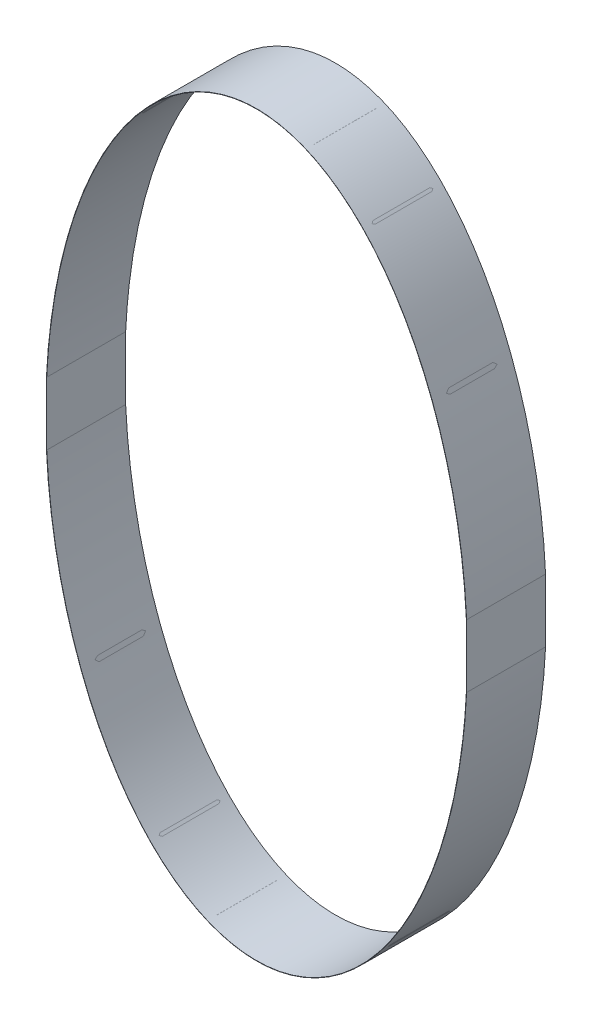
ISO-10303-21;
HEADER;
FILE_DESCRIPTION(('STEP AP214'),'2;1');
FILE_NAME('part.step','',(''),(''),'','','');
FILE_SCHEMA(('AUTOMOTIVE_DESIGN { 1 0 10303 214 1 1 1 1 }'));
ENDSEC;
DATA;
#1=APPLICATION_CONTEXT('core data for automotive mechanical design processes');
#2=APPLICATION_PROTOCOL_DEFINITION('international standard','automotive_design',2000,#1);
#3=PRODUCT_CONTEXT('',#1,'mechanical');
#4=PRODUCT('Part','Part','',(#3));
#5=PRODUCT_RELATED_PRODUCT_CATEGORY('part','',(#4));
#6=PRODUCT_DEFINITION_FORMATION('','',#4);
#7=PRODUCT_DEFINITION_CONTEXT('part definition',#1,'design');
#8=PRODUCT_DEFINITION('design','',#6,#7);
#9=PRODUCT_DEFINITION_SHAPE('','',#8);
#10=(LENGTH_UNIT() NAMED_UNIT(*) SI_UNIT(.MILLI.,.METRE.));
#11=(NAMED_UNIT(*) PLANE_ANGLE_UNIT() SI_UNIT($,.RADIAN.));
#12=(NAMED_UNIT(*) SI_UNIT($,.STERADIAN.) SOLID_ANGLE_UNIT());
#13=UNCERTAINTY_MEASURE_WITH_UNIT(LENGTH_MEASURE(1.E-05),#10,'distance_accuracy_value','');
#14=(GEOMETRIC_REPRESENTATION_CONTEXT(3) GLOBAL_UNCERTAINTY_ASSIGNED_CONTEXT((#13)) GLOBAL_UNIT_ASSIGNED_CONTEXT((#10,
#11,#12)) REPRESENTATION_CONTEXT('',''));
#15=CARTESIAN_POINT('',(0.,0.,0.));
#16=DIRECTION('',(0.,0.,1.));
#17=DIRECTION('',(1.,0.,0.));
#18=AXIS2_PLACEMENT_3D('',#15,#16,#17);
#19=CARTESIAN_POINT('',(5.5511881945827,373.447038357342,80.01));
#20=DIRECTION('',(0.,0.,-1.));
#21=DIRECTION('',(-1.,0.,0.));
#22=AXIS2_PLACEMENT_3D('',#19,#20,#21);
#23=PLANE('',#22);
#24=CARTESIAN_POINT('',(217.655667456049,31.3558868090757,80.01));
#25=CARTESIAN_POINT('',(216.761538796414,49.6275996711343,80.01));
#26=CARTESIAN_POINT('',(215.106622696031,67.7317169564678,80.01));
#27=CARTESIAN_POINT('',(211.465794378231,94.6326944100097,80.01));
#28=CARTESIAN_POINT('',(210.058349688739,103.556986491217,80.01));
#29=CARTESIAN_POINT('',(206.842986250278,121.317349322195,80.01));
#30=CARTESIAN_POINT('',(205.035117815451,130.153431155783,80.01));
#31=CARTESIAN_POINT('',(200.998292205224,147.732832237052,80.01));
#32=CARTESIAN_POINT('',(198.769420845787,156.476170389324,80.01));
#33=CARTESIAN_POINT('',(193.860122382339,173.863372463116,80.01));
#34=CARTESIAN_POINT('',(191.17983933568,182.507268119354,80.01));
#35=CARTESIAN_POINT('',(185.324055574238,199.685966817718,80.01));
#36=CARTESIAN_POINT('',(182.148803273316,208.220824583493,80.01));
#37=CARTESIAN_POINT('',(177.83114736122,218.812604997389,80.01));
#38=CARTESIAN_POINT('',(176.950128624592,220.927108707513,80.01));
#39=CARTESIAN_POINT('',(175.151875839755,225.148138175306,80.01));
#40=CARTESIAN_POINT('',(174.234121049992,227.25577060331,80.01));
#41=CARTESIAN_POINT('',(171.433456071659,233.546485348865,80.01));
#42=CARTESIAN_POINT('',(169.500838555173,237.703118105873,80.01));
#43=CARTESIAN_POINT('',(163.49637176035,250.055757905256,80.01));
#44=CARTESIAN_POINT('',(159.218829347759,258.135029228337,80.01));
#45=CARTESIAN_POINT('',(150.042217474111,273.940840572469,80.01));
#46=CARTESIAN_POINT('',(145.143750795004,281.667722686536,80.01));
#47=CARTESIAN_POINT('',(138.564701577109,291.067553912727,80.01));
#48=CARTESIAN_POINT('',(137.225975145662,292.934514452266,80.01));
#49=CARTESIAN_POINT('',(134.500447339706,296.641151863958,80.01));
#50=CARTESIAN_POINT('',(133.116062143658,298.47745892341,80.01));
#51=CARTESIAN_POINT('',(128.906246069953,303.919943263367,80.01));
#52=CARTESIAN_POINT('',(126.020154190536,307.465333786316,80.01));
#53=CARTESIAN_POINT('',(117.106753193142,317.835525117906,80.01));
#54=CARTESIAN_POINT('',(110.826197943596,324.396304872797,80.01));
#55=CARTESIAN_POINT('',(100.804785611549,333.611342053245,80.01));
#56=CARTESIAN_POINT('',(97.3638070733275,336.578237025395,80.01));
#57=CARTESIAN_POINT('',(90.2585155092146,342.279190217529,80.01));
#58=CARTESIAN_POINT('',(86.5942841289921,345.013333556979,80.01));
#59=CARTESIAN_POINT('',(80.9086444369119,348.917202067112,80.01));
#60=CARTESIAN_POINT('',(78.9814147480908,350.185792748693,80.01));
#61=CARTESIAN_POINT('',(75.0608442892962,352.651300995115,80.01));
#62=CARTESIAN_POINT('',(73.0812105236744,353.839592482322,80.01));
#63=CARTESIAN_POINT('',(67.0825409536958,357.267120379781,80.01));
#64=CARTESIAN_POINT('',(63.003834081652,359.369233602432,80.01));
#65=CARTESIAN_POINT('',(54.6759516946018,363.181725751446,80.01));
#66=CARTESIAN_POINT('',(50.4268096122745,364.892181505588,80.01));
#67=CARTESIAN_POINT('',(43.9141942224552,367.138669884189,80.01));
#68=CARTESIAN_POINT('',(41.7201416555405,367.83423029326,80.01));
#69=CARTESIAN_POINT('',(38.3925851319078,368.793745779756,80.01));
#70=CARTESIAN_POINT('',(37.2773175493931,369.099607762117,80.01));
#71=CARTESIAN_POINT('',(35.0343018079215,369.682651555841,80.01));
#72=CARTESIAN_POINT('',(33.9064672378064,369.959786347098,80.01));
#73=CARTESIAN_POINT('',(23.7634648561725,372.307540470079,80.01));
#74=CARTESIAN_POINT('',(14.6876480425494,373.387651388037,80.01));
#75=CARTESIAN_POINT('',(0.982958270599104,373.476731841995,80.01));
#76=CARTESIAN_POINT('',(-3.60047781648873,373.250480105309,80.01));
#77=CARTESIAN_POINT('',(-9.3492751407335,372.639410450004,80.01));
#78=CARTESIAN_POINT('',(-10.5014261637161,372.500571263766,80.01));
#79=CARTESIAN_POINT('',(-12.8011012339354,372.190660040043,80.01));
#80=CARTESIAN_POINT('',(-13.9462384788374,372.01995522626,80.01));
#81=CARTESIAN_POINT('',(-17.3678319986305,371.461540270001,80.01));
#82=CARTESIAN_POINT('',(-19.630476063238,371.027549732247,80.01));
#83=CARTESIAN_POINT('',(-30.8549878346718,368.560362441015,80.01));
#84=CARTESIAN_POINT('',(-39.5521896608223,365.640353126573,80.01));
#85=CARTESIAN_POINT('',(-50.108482032178,360.934171689376,80.01));
#86=CARTESIAN_POINT('',(-52.2070577524753,359.937990908389,80.01));
#87=CARTESIAN_POINT('',(-56.3335638170729,357.862491063735,80.01));
#88=CARTESIAN_POINT('',(-58.366202352763,356.781268135632,80.01));
#89=CARTESIAN_POINT('',(-64.3776649444656,353.414834881783,80.01));
#90=CARTESIAN_POINT('',(-68.2702251637759,351.007128722801,80.01));
#91=CARTESIAN_POINT('',(-79.6376582121228,343.343454377967,80.01));
#92=CARTESIAN_POINT('',(-86.8040638327139,337.649458518305,80.01));
#93=CARTESIAN_POINT('',(-95.3266666159781,329.913683687697,80.01));
#94=CARTESIAN_POINT('',(-97.0111486352412,328.333573477449,80.01));
#95=CARTESIAN_POINT('',(-100.329192872917,325.121474789509,80.01));
#96=CARTESIAN_POINT('',(-101.95867427146,323.493578500022,80.01));
#97=CARTESIAN_POINT('',(-106.763693905535,318.548192698215,80.01));
#98=CARTESIAN_POINT('',(-109.85597993191,315.169133716383,80.01));
#99=CARTESIAN_POINT('',(-118.833889348996,304.810868216963,80.01));
#100=CARTESIAN_POINT('',(-124.422210484166,297.611790751277,80.01));
#101=CARTESIAN_POINT('',(-134.933040574988,282.72123203743,80.01));
#102=CARTESIAN_POINT('',(-139.854761343217,275.029167882438,80.01));
#103=CARTESIAN_POINT('',(-145.641664734464,265.143967540603,80.01));
#104=CARTESIAN_POINT('',(-146.780701563211,263.153361212624,80.01));
#105=CARTESIAN_POINT('',(-149.023086737535,259.145755011093,80.01));
#106=CARTESIAN_POINT('',(-150.127278232059,257.127169164723,80.01));
#107=CARTESIAN_POINT('',(-153.381630889738,251.044171170167,80.01));
#108=CARTESIAN_POINT('',(-155.469263022701,246.961090394572,80.01));
#109=CARTESIAN_POINT('',(-161.505038276358,234.63493058318,80.01));
#110=CARTESIAN_POINT('',(-165.226888620315,226.315214600375,80.01));
#111=CARTESIAN_POINT('',(-172.140903982485,209.49639791544,80.01));
#112=CARTESIAN_POINT('',(-175.332745698512,200.997187722885,80.01));
#113=CARTESIAN_POINT('',(-181.237244349436,183.836485274654,80.01));
#114=CARTESIAN_POINT('',(-183.949718542828,175.174931131226,80.01));
#115=CARTESIAN_POINT('',(-188.930509488705,157.701403238615,80.01));
#116=CARTESIAN_POINT('',(-191.198719198488,148.889393238051,80.01));
#117=CARTESIAN_POINT('',(-194.285682031028,135.564580334359,80.01));
#118=CARTESIAN_POINT('',(-195.262031544157,131.105149467192,80.01));
#119=CARTESIAN_POINT('',(-197.111574675483,122.151352667906,80.01));
#120=CARTESIAN_POINT('',(-197.985166530201,117.654772092924,80.01));
#121=CARTESIAN_POINT('',(-200.450952909372,104.128217029154,80.01));
#122=CARTESIAN_POINT('',(-201.884157890465,95.0861844256109,80.01));
#123=CARTESIAN_POINT('',(-205.580897443482,67.8904577934389,80.01));
#124=CARTESIAN_POINT('',(-207.244770283804,49.6675061033269,80.01));
#125=CARTESIAN_POINT('',(-208.140851937142,31.3558787160416,80.01));
#126=B_SPLINE_CURVE_WITH_KNOTS('',3,(#24,#25,#26,#27,#28,#29,#30,#31,#32,#33,#34,#35,#36,#37,
#38,#39,#40,#41,#42,#43,#44,#45,#46,#47,#48,#49,#50,#51,#52,#53,#54,#55,#56,#57,#58,#59,#60,#61,
#62,#63,#64,#65,#66,#67,#68,#69,#70,#71,#72,#73,#74,#75,#76,#77,#78,#79,#80,#81,#82,#83,#84,#85,
#86,#87,#88,#89,#90,#91,#92,#93,#94,#95,#96,#97,#98,#99,#100,#101,#102,#103,#104,#105,#106,#107,
#108,#109,#110,#111,#112,#113,#114,#115,#116,#117,#118,#119,#120,#121,#122,#123,#124,#125),
.UNSPECIFIED.,.F.,.F.,(4,2,2,2,2,2,2,2,2,2,2,2,2,2,2,2,2,2,2,2,2,2,2,2,2,2,2,2,2,2,2,2,2,2,2,2,
2,2,2,2,2,2,2,2,2,2,2,2,2,2,4),(0.,0.0624999999999998,0.0937499999999997,0.125,
0.156249999999999,0.187499999999999,0.218749999999999,0.226562499999999,0.234374999999999,
0.249999999999999,0.281249999999999,0.312499999999999,0.320312499999999,0.328124999999999,
0.343749999999999,0.374999999999999,0.390624999999999,0.406249999999999,0.414062499999999,
0.421874999999999,0.4375,0.453125,0.4609375,0.46484375,0.46875,0.5,0.515625,0.51953125,
0.5234375,0.53125,0.562500000000001,0.570312500000001,0.578125000000001,0.593750000000001,
0.625000000000001,0.632812500000001,0.640625000000001,0.656250000000001,0.687500000000001,
0.718750000000001,0.726562500000001,0.734375000000001,0.750000000000001,0.781250000000001,
0.812500000000001,0.843750000000001,0.875000000000001,0.890625,0.90625,0.9375,1.),.UNSPECIFIED.);
#127=CARTESIAN_POINT('',(217.655667456049,31.3558868090757,80.01));
#128=VERTEX_POINT('',#127);
#129=CARTESIAN_POINT('',(-208.140851937142,31.3558787160417,80.01));
#130=VERTEX_POINT('',#129);
#131=EDGE_CURVE('E229',#128,#130,#126,.T.);
#132=ORIENTED_EDGE('',*,*,#131,.T.);
#133=DIRECTION('',(6.37565235989161E-05,-0.999999997967553,0.));
#134=VECTOR('',#133,1.);
#135=CARTESIAN_POINT('',(-208.140851540593,31.3496589621477,80.01));
#136=LINE('',#135,#134);
#137=CARTESIAN_POINT('',(-208.136775518514,-32.5814000091829,80.01));
#138=VERTEX_POINT('',#137);
#139=EDGE_CURVE('E203',#130,#138,#136,.T.);
#140=ORIENTED_EDGE('',*,*,#139,.T.);
#141=CARTESIAN_POINT('',(-208.136775518514,-32.5814000091829,80.01));
#142=CARTESIAN_POINT('',(-207.240390922218,-50.8512608082998,80.01));
#143=CARTESIAN_POINT('',(-205.58335599037,-68.9534383848635,80.01));
#144=CARTESIAN_POINT('',(-201.939492343226,-95.8513582995253,80.01));
#145=CARTESIAN_POINT('',(-200.531059912315,-104.774606468286,80.01));
#146=CARTESIAN_POINT('',(-197.313760171547,-122.532828065384,80.01));
#147=CARTESIAN_POINT('',(-195.504943201954,-131.36781259109,80.01));
#148=CARTESIAN_POINT('',(-191.466250935442,-148.94496052101,80.01));
#149=CARTESIAN_POINT('',(-189.236461488844,-157.687142850686,80.01));
#150=CARTESIAN_POINT('',(-184.325347691783,-175.071967913147,80.01));
#151=CARTESIAN_POINT('',(-181.644167452587,-183.714642414855,80.01));
#152=CARTESIAN_POINT('',(-175.786598497343,-200.890824105312,80.01));
#153=CARTESIAN_POINT('',(-172.610458292551,-209.424386077666,80.01));
#154=CARTESIAN_POINT('',(-168.29168831941,-220.014491820239,80.01));
#155=CARTESIAN_POINT('',(-167.410446546404,-222.1286578373,80.01));
#156=CARTESIAN_POINT('',(-165.611746918989,-226.349006138353,80.01));
#157=CARTESIAN_POINT('',(-164.69376156158,-228.456310392965,80.01));
#158=CARTESIAN_POINT('',(-161.892392807168,-234.746059410878,80.01));
#159=CARTESIAN_POINT('',(-159.959307182952,-238.902032995586,80.01));
#160=CARTESIAN_POINT('',(-153.95343729117,-251.252645619912,80.01));
#161=CARTESIAN_POINT('',(-149.674961312575,-259.330499618407,80.01));
#162=CARTESIAN_POINT('',(-140.49647170064,-275.133318817862,80.01));
#163=CARTESIAN_POINT('',(-135.597061067334,-282.858626382563,80.01));
#164=CARTESIAN_POINT('',(-129.016811041483,-292.256366451103,80.01));
#165=CARTESIAN_POINT('',(-127.677843372791,-294.122902563342,80.01));
#166=CARTESIAN_POINT('',(-124.951830423512,-297.828677888719,80.01));
#167=CARTESIAN_POINT('',(-123.567214044351,-299.664531701708,80.01));
#168=CARTESIAN_POINT('',(-119.356693444484,-305.105655936016,80.01));
#169=CARTESIAN_POINT('',(-116.470133378299,-308.650114820505,80.01));
#170=CARTESIAN_POINT('',(-107.555329536085,-319.017428154065,80.01));
#171=CARTESIAN_POINT('',(-101.273841799743,-325.57617956721,80.01));
#172=CARTESIAN_POINT('',(-91.251017790665,-334.787960940303,80.01));
#173=CARTESIAN_POINT('',(-87.8095664441574,-337.753734862033,80.01));
#174=CARTESIAN_POINT('',(-80.703320100127,-343.452362101128,80.01));
#175=CARTESIAN_POINT('',(-77.0386067850919,-346.185300603517,80.01));
#176=CARTESIAN_POINT('',(-71.3522322165627,-350.087286399039,80.01));
#177=CARTESIAN_POINT('',(-69.4246412404476,-351.355308449199,80.01));
#178=CARTESIAN_POINT('',(-65.5038120355588,-353.819357822749,80.01));
#179=CARTESIAN_POINT('',(-63.5240535944723,-355.006914232233,80.01));
#180=CARTESIAN_POINT('',(-57.5250243446302,-358.432219092342,80.01));
#181=CARTESIAN_POINT('',(-53.4460967979627,-360.532826595258,80.01));
#182=CARTESIAN_POINT('',(-45.1178130126781,-364.342254300132,80.01));
#183=CARTESIAN_POINT('',(-40.868490202876,-366.051151349391,80.01));
#184=CARTESIAN_POINT('',(-34.3556354123688,-368.295256498123,80.01));
#185=CARTESIAN_POINT('',(-32.1615083318798,-368.990014953924,80.01));
#186=CARTESIAN_POINT('',(-28.8338482335727,-369.94831535634,80.01));
#187=CARTESIAN_POINT('',(-27.7185474924821,-370.253770283732,80.01));
#188=CARTESIAN_POINT('',(-25.4754682154432,-370.835995757304,80.01));
#189=CARTESIAN_POINT('',(-24.3476857090997,-371.112698626266,80.01));
#190=CARTESIAN_POINT('',(-14.2051794461574,-373.456594800218,80.01));
#191=CARTESIAN_POINT('',(-5.12995007591106,-374.533403707491,80.01));
#192=CARTESIAN_POINT('',(8.57363445641877,-374.61774763201,80.01));
#193=CARTESIAN_POINT('',(13.156664665942,-374.389953355259,80.01));
#194=CARTESIAN_POINT('',(18.9049063853056,-373.777005612353,80.01));
#195=CARTESIAN_POINT('',(20.0569841057652,-373.637787012572,80.01));
#196=CARTESIAN_POINT('',(22.356263185131,-373.327158959204,80.01));
#197=CARTESIAN_POINT('',(23.5012024180695,-373.156102225317,80.01));
#198=CARTESIAN_POINT('',(26.9222017948338,-372.596650406322,80.01));
#199=CARTESIAN_POINT('',(29.1844496192336,-372.161993808435,80.01));
#200=CARTESIAN_POINT('',(40.4069788321689,-369.691595290089,80.01));
#201=CARTESIAN_POINT('',(49.1025898480166,-366.769394589557,80.01));
#202=CARTESIAN_POINT('',(59.6568826371635,-362.060876107064,80.01));
#203=CARTESIAN_POINT('',(61.7549935887176,-361.064276720189,80.01));
#204=CARTESIAN_POINT('',(65.8805179591931,-358.98802860243,80.01));
#205=CARTESIAN_POINT('',(67.9126760296176,-357.906455438346,80.01));
#206=CARTESIAN_POINT('',(73.9227249581772,-354.539036720061,80.01));
#207=CARTESIAN_POINT('',(77.8143795641059,-352.13076030918,80.01));
#208=CARTESIAN_POINT('',(89.1791857152996,-344.465595743589,80.01));
#209=CARTESIAN_POINT('',(96.3439588288855,-338.770898261519,80.01));
#210=CARTESIAN_POINT('',(104.864628628064,-331.034529529383,80.01));
#211=CARTESIAN_POINT('',(106.548742734812,-329.454301375486,80.01));
#212=CARTESIAN_POINT('',(109.865987866124,-326.24206853339,80.01));
#213=CARTESIAN_POINT('',(111.495080246622,-324.614117306204,80.01));
#214=CARTESIAN_POINT('',(116.298961231467,-319.668599977664,80.01));
#215=CARTESIAN_POINT('',(119.390525900175,-316.289497570629,80.01));
#216=CARTESIAN_POINT('',(128.366364771385,-305.931214967927,80.01));
#217=CARTESIAN_POINT('',(133.953429173248,-298.732275961258,80.01));
#218=CARTESIAN_POINT('',(144.46192765151,-283.842226664955,80.01));
#219=CARTESIAN_POINT('',(149.382574183815,-276.150534060223,80.01));
#220=CARTESIAN_POINT('',(155.168226317641,-266.265919619365,80.01));
#221=CARTESIAN_POINT('',(156.307017519173,-264.275436591779,80.01));
#222=CARTESIAN_POINT('',(158.548920283395,-260.268088785427,80.01));
#223=CARTESIAN_POINT('',(159.652869793423,-258.249647704156,80.01));
#224=CARTESIAN_POINT('',(162.90655919534,-252.167008301811,80.01));
#225=CARTESIAN_POINT('',(164.993769724233,-248.084182118207,80.01));
#226=CARTESIAN_POINT('',(171.028334448138,-235.758828209238,80.01));
#227=CARTESIAN_POINT('',(174.749449761206,-227.439705445452,80.01));
#228=CARTESIAN_POINT('',(181.66211226805,-210.62217026574,80.01));
#229=CARTESIAN_POINT('',(184.853336345077,-202.123648455975,80.01));
#230=CARTESIAN_POINT('',(190.756701122683,-184.964407210153,80.01));
#231=CARTESIAN_POINT('',(193.468659174771,-176.303625936943,80.01));
#232=CARTESIAN_POINT('',(198.448509814324,-158.831721366942,80.01));
#233=CARTESIAN_POINT('',(200.716295407114,-150.02056184622,80.01));
#234=CARTESIAN_POINT('',(203.802687281941,-136.697079716721,80.01));
#235=CARTESIAN_POINT('',(204.778857375979,-132.238101635333,80.01));
#236=CARTESIAN_POINT('',(206.628063162813,-123.285228470854,80.01));
#237=CARTESIAN_POINT('',(207.501487716485,-118.78917130291,80.01));
#238=CARTESIAN_POINT('',(209.966876539492,-105.263810158657,80.01));
#239=CARTESIAN_POINT('',(211.399855771774,-96.222588008681,80.01));
#240=CARTESIAN_POINT('',(215.096029159953,-69.0293340989996,80.01));
#241=CARTESIAN_POINT('',(216.759671523688,-50.8080857556217,80.01));
#242=CARTESIAN_POINT('',(217.655667456049,-32.4982147708908,80.01));
#243=B_SPLINE_CURVE_WITH_KNOTS('',3,(#141,#142,#143,#144,#145,#146,#147,#148,#149,#150,#151,
#152,#153,#154,#155,#156,#157,#158,#159,#160,#161,#162,#163,#164,#165,#166,#167,#168,#169,#170,
#171,#172,#173,#174,#175,#176,#177,#178,#179,#180,#181,#182,#183,#184,#185,#186,#187,#188,#189,
#190,#191,#192,#193,#194,#195,#196,#197,#198,#199,#200,#201,#202,#203,#204,#205,#206,#207,#208,
#209,#210,#211,#212,#213,#214,#215,#216,#217,#218,#219,#220,#221,#222,#223,#224,#225,#226,#227,
#228,#229,#230,#231,#232,#233,#234,#235,#236,#237,#238,#239,#240,#241,#242),.UNSPECIFIED.,.F.,
.F.,(4,2,2,2,2,2,2,2,2,2,2,2,2,2,2,2,2,2,2,2,2,2,2,2,2,2,2,2,2,2,2,2,2,2,2,2,2,2,2,2,2,2,2,2,2,
2,2,2,2,2,4),(0.,0.0625000000000009,0.0937500000000013,0.125000000000002,0.156250000000002,
0.187500000000003,0.218750000000003,0.226562500000003,0.234375000000003,0.250000000000004,
0.281250000000004,0.312500000000004,0.320312500000004,0.328125000000004,0.343750000000004,
0.375000000000004,0.390625000000004,0.406250000000004,0.414062500000004,0.421875000000003,
0.437500000000003,0.453125000000003,0.460937500000003,0.464843750000003,0.468750000000003,
0.500000000000003,0.515625000000003,0.519531250000003,0.523437500000003,0.531250000000003,
0.562500000000002,0.570312500000002,0.578125000000002,0.593750000000002,0.625000000000002,
0.632812500000002,0.640625000000002,0.656250000000002,0.687500000000002,0.718750000000003,
0.726562500000003,0.734375000000003,0.750000000000002,0.781250000000002,0.812500000000002,
0.843750000000001,0.875000000000001,0.890625000000001,0.906250000000001,0.9375,1.),.UNSPECIFIED.);
#244=CARTESIAN_POINT('',(217.655667456049,-32.4982147708912,80.01));
#245=VERTEX_POINT('',#244);
#246=EDGE_CURVE('E191',#138,#245,#243,.T.);
#247=ORIENTED_EDGE('',*,*,#246,.T.);
#248=DIRECTION('',(0.,-1.,0.));
#249=VECTOR('',#248,1.);
#250=CARTESIAN_POINT('',(217.655667456049,31.3496751563053,80.01));
#251=LINE('',#250,#249);
#252=EDGE_CURVE('E199',#128,#245,#251,.T.);
#253=ORIENTED_EDGE('',*,*,#252,.F.);
#254=EDGE_LOOP('',(#132,#140,#247,#253));
#255=FACE_BOUND('',#254,.T.);
#256=CARTESIAN_POINT('',(4.75740795747015,-0.571163980907841,80.01));
#257=DIRECTION('',(0.,0.,1.));
#258=DIRECTION('',(0.,1.,0.));
#259=AXIS2_PLACEMENT_3D('',#256,#257,#258);
#260=ELLIPSE('',#259,373.766782114242,213.424008);
#261=CARTESIAN_POINT('',(217.401667456049,31.3496751563053,80.01));
#262=VERTEX_POINT('',#261);
#263=CARTESIAN_POINT('',(-207.886851541109,31.3496751563047,80.01));
#264=VERTEX_POINT('',#263);
#265=EDGE_CURVE('E136',#262,#264,#260,.T.);
#266=ORIENTED_EDGE('',*,*,#265,.F.);
#267=DIRECTION('',(0.,-1.,0.));
#268=VECTOR('',#267,1.);
#269=CARTESIAN_POINT('',(217.401667456049,31.3496751563053,80.01));
#270=LINE('',#269,#268);
#271=CARTESIAN_POINT('',(217.401667456049,-32.4920031181204,80.01));
#272=VERTEX_POINT('',#271);
#273=EDGE_CURVE('E161',#262,#272,#270,.T.);
#274=ORIENTED_EDGE('',*,*,#273,.T.);
#275=CARTESIAN_POINT('',(4.75740795747015,-0.571163980907841,80.01));
#276=DIRECTION('',(0.,0.,1.));
#277=DIRECTION('',(0.,1.,0.));
#278=AXIS2_PLACEMENT_3D('',#275,#276,#277);
#279=ELLIPSE('',#278,373.766782114242,213.424008);
#280=CARTESIAN_POINT('',(-207.882775915586,-32.5751639809079,80.01));
#281=VERTEX_POINT('',#280);
#282=EDGE_CURVE('E157',#281,#272,#279,.T.);
#283=ORIENTED_EDGE('',*,*,#282,.F.);
#284=DIRECTION('',(6.37565235989161E-05,-0.999999997967553,0.));
#285=VECTOR('',#284,1.);
#286=CARTESIAN_POINT('',(-207.886851541109,31.3496751563047,80.01));
#287=LINE('',#286,#285);
#288=EDGE_CURVE('E150',#264,#281,#287,.T.);
#289=ORIENTED_EDGE('',*,*,#288,.F.);
#290=EDGE_LOOP('',(#266,#274,#283,#289));
#291=FACE_BOUND('',#290,.T.);
#292=ADVANCED_FACE('F71',(#255,#291),#23,.F.);
#293=CARTESIAN_POINT('',(5.5511881945827,373.447038357342,0.));
#294=DIRECTION('',(0.,0.,-1.));
#295=DIRECTION('',(-1.,0.,0.));
#296=AXIS2_PLACEMENT_3D('',#293,#294,#295);
#297=PLANE('',#296);
#298=CARTESIAN_POINT('',(217.655667456049,31.3558868090757,0.));
#299=CARTESIAN_POINT('',(216.761538796414,49.6275996711343,0.));
#300=CARTESIAN_POINT('',(215.106622696031,67.7317169564678,0.));
#301=CARTESIAN_POINT('',(211.465794378231,94.6326944100097,0.));
#302=CARTESIAN_POINT('',(210.058349688739,103.556986491217,0.));
#303=CARTESIAN_POINT('',(206.842986250278,121.317349322195,0.));
#304=CARTESIAN_POINT('',(205.035117815451,130.153431155783,0.));
#305=CARTESIAN_POINT('',(200.998292205224,147.732832237052,0.));
#306=CARTESIAN_POINT('',(198.769420845787,156.476170389324,0.));
#307=CARTESIAN_POINT('',(193.860122382339,173.863372463116,0.));
#308=CARTESIAN_POINT('',(191.17983933568,182.507268119354,0.));
#309=CARTESIAN_POINT('',(185.324055574238,199.685966817718,0.));
#310=CARTESIAN_POINT('',(182.148803273316,208.220824583493,0.));
#311=CARTESIAN_POINT('',(177.83114736122,218.812604997389,0.));
#312=CARTESIAN_POINT('',(176.950128624592,220.927108707513,0.));
#313=CARTESIAN_POINT('',(175.151875839755,225.148138175306,0.));
#314=CARTESIAN_POINT('',(174.234121049992,227.25577060331,0.));
#315=CARTESIAN_POINT('',(171.433456071659,233.546485348865,0.));
#316=CARTESIAN_POINT('',(169.500838555173,237.703118105873,0.));
#317=CARTESIAN_POINT('',(163.49637176035,250.055757905256,0.));
#318=CARTESIAN_POINT('',(159.218829347759,258.135029228337,0.));
#319=CARTESIAN_POINT('',(150.042217474111,273.940840572469,0.));
#320=CARTESIAN_POINT('',(145.143750795004,281.667722686536,0.));
#321=CARTESIAN_POINT('',(138.564701577109,291.067553912727,0.));
#322=CARTESIAN_POINT('',(137.225975145662,292.934514452266,0.));
#323=CARTESIAN_POINT('',(134.500447339706,296.641151863958,0.));
#324=CARTESIAN_POINT('',(133.116062143658,298.47745892341,0.));
#325=CARTESIAN_POINT('',(128.906246069953,303.919943263367,0.));
#326=CARTESIAN_POINT('',(126.020154190536,307.465333786316,0.));
#327=CARTESIAN_POINT('',(117.106753193142,317.835525117906,0.));
#328=CARTESIAN_POINT('',(110.826197943596,324.396304872797,0.));
#329=CARTESIAN_POINT('',(100.804785611549,333.611342053245,0.));
#330=CARTESIAN_POINT('',(97.3638070733275,336.578237025395,0.));
#331=CARTESIAN_POINT('',(90.2585155092146,342.279190217529,0.));
#332=CARTESIAN_POINT('',(86.5942841289921,345.013333556979,0.));
#333=CARTESIAN_POINT('',(80.9086444369119,348.917202067112,0.));
#334=CARTESIAN_POINT('',(78.9814147480908,350.185792748693,0.));
#335=CARTESIAN_POINT('',(75.0608442892962,352.651300995115,0.));
#336=CARTESIAN_POINT('',(73.0812105236744,353.839592482322,0.));
#337=CARTESIAN_POINT('',(67.0825409536958,357.267120379781,0.));
#338=CARTESIAN_POINT('',(63.003834081652,359.369233602432,0.));
#339=CARTESIAN_POINT('',(54.6759516946018,363.181725751446,0.));
#340=CARTESIAN_POINT('',(50.4268096122745,364.892181505588,0.));
#341=CARTESIAN_POINT('',(43.9141942224552,367.138669884189,0.));
#342=CARTESIAN_POINT('',(41.7201416555405,367.83423029326,0.));
#343=CARTESIAN_POINT('',(38.3925851319078,368.793745779756,0.));
#344=CARTESIAN_POINT('',(37.2773175493931,369.099607762117,0.));
#345=CARTESIAN_POINT('',(35.0343018079215,369.682651555841,0.));
#346=CARTESIAN_POINT('',(33.9064672378064,369.959786347098,0.));
#347=CARTESIAN_POINT('',(23.7634648561725,372.307540470079,0.));
#348=CARTESIAN_POINT('',(14.6876480425494,373.387651388037,0.));
#349=CARTESIAN_POINT('',(0.982958270599104,373.476731841995,0.));
#350=CARTESIAN_POINT('',(-3.60047781648873,373.250480105309,0.));
#351=CARTESIAN_POINT('',(-9.3492751407335,372.639410450004,0.));
#352=CARTESIAN_POINT('',(-10.5014261637161,372.500571263766,0.));
#353=CARTESIAN_POINT('',(-12.8011012339354,372.190660040043,0.));
#354=CARTESIAN_POINT('',(-13.9462384788374,372.01995522626,0.));
#355=CARTESIAN_POINT('',(-17.3678319986305,371.461540270001,0.));
#356=CARTESIAN_POINT('',(-19.630476063238,371.027549732247,0.));
#357=CARTESIAN_POINT('',(-30.8549878346718,368.560362441015,0.));
#358=CARTESIAN_POINT('',(-39.5521896608223,365.640353126573,0.));
#359=CARTESIAN_POINT('',(-50.108482032178,360.934171689376,0.));
#360=CARTESIAN_POINT('',(-52.2070577524753,359.937990908389,0.));
#361=CARTESIAN_POINT('',(-56.3335638170729,357.862491063735,0.));
#362=CARTESIAN_POINT('',(-58.366202352763,356.781268135632,0.));
#363=CARTESIAN_POINT('',(-64.3776649444656,353.414834881783,0.));
#364=CARTESIAN_POINT('',(-68.2702251637759,351.007128722801,0.));
#365=CARTESIAN_POINT('',(-79.6376582121228,343.343454377967,0.));
#366=CARTESIAN_POINT('',(-86.8040638327139,337.649458518305,0.));
#367=CARTESIAN_POINT('',(-95.3266666159781,329.913683687697,0.));
#368=CARTESIAN_POINT('',(-97.0111486352412,328.333573477449,0.));
#369=CARTESIAN_POINT('',(-100.329192872917,325.121474789509,0.));
#370=CARTESIAN_POINT('',(-101.95867427146,323.493578500022,0.));
#371=CARTESIAN_POINT('',(-106.763693905535,318.548192698215,0.));
#372=CARTESIAN_POINT('',(-109.85597993191,315.169133716383,0.));
#373=CARTESIAN_POINT('',(-118.833889348996,304.810868216963,0.));
#374=CARTESIAN_POINT('',(-124.422210484166,297.611790751277,0.));
#375=CARTESIAN_POINT('',(-134.933040574988,282.72123203743,0.));
#376=CARTESIAN_POINT('',(-139.854761343217,275.029167882438,0.));
#377=CARTESIAN_POINT('',(-145.641664734464,265.143967540603,0.));
#378=CARTESIAN_POINT('',(-146.780701563211,263.153361212624,0.));
#379=CARTESIAN_POINT('',(-149.023086737535,259.145755011093,0.));
#380=CARTESIAN_POINT('',(-150.127278232059,257.127169164723,0.));
#381=CARTESIAN_POINT('',(-153.381630889738,251.044171170167,0.));
#382=CARTESIAN_POINT('',(-155.469263022701,246.961090394572,0.));
#383=CARTESIAN_POINT('',(-161.505038276358,234.63493058318,0.));
#384=CARTESIAN_POINT('',(-165.226888620315,226.315214600375,0.));
#385=CARTESIAN_POINT('',(-172.140903982485,209.49639791544,0.));
#386=CARTESIAN_POINT('',(-175.332745698512,200.997187722885,0.));
#387=CARTESIAN_POINT('',(-181.237244349436,183.836485274654,0.));
#388=CARTESIAN_POINT('',(-183.949718542828,175.174931131226,0.));
#389=CARTESIAN_POINT('',(-188.930509488705,157.701403238615,0.));
#390=CARTESIAN_POINT('',(-191.198719198488,148.889393238051,0.));
#391=CARTESIAN_POINT('',(-194.285682031028,135.564580334359,0.));
#392=CARTESIAN_POINT('',(-195.262031544157,131.105149467192,0.));
#393=CARTESIAN_POINT('',(-197.111574675483,122.151352667906,0.));
#394=CARTESIAN_POINT('',(-197.985166530201,117.654772092924,0.));
#395=CARTESIAN_POINT('',(-200.450952909372,104.128217029154,0.));
#396=CARTESIAN_POINT('',(-201.884157890465,95.0861844256109,0.));
#397=CARTESIAN_POINT('',(-205.580897443482,67.8904577934389,0.));
#398=CARTESIAN_POINT('',(-207.244770283804,49.6675061033269,0.));
#399=CARTESIAN_POINT('',(-208.140851937142,31.3558787160416,0.));
#400=B_SPLINE_CURVE_WITH_KNOTS('',3,(#298,#299,#300,#301,#302,#303,#304,#305,#306,#307,#308,
#309,#310,#311,#312,#313,#314,#315,#316,#317,#318,#319,#320,#321,#322,#323,#324,#325,#326,#327,
#328,#329,#330,#331,#332,#333,#334,#335,#336,#337,#338,#339,#340,#341,#342,#343,#344,#345,#346,
#347,#348,#349,#350,#351,#352,#353,#354,#355,#356,#357,#358,#359,#360,#361,#362,#363,#364,#365,
#366,#367,#368,#369,#370,#371,#372,#373,#374,#375,#376,#377,#378,#379,#380,#381,#382,#383,#384,
#385,#386,#387,#388,#389,#390,#391,#392,#393,#394,#395,#396,#397,#398,#399),.UNSPECIFIED.,.F.,
.F.,(4,2,2,2,2,2,2,2,2,2,2,2,2,2,2,2,2,2,2,2,2,2,2,2,2,2,2,2,2,2,2,2,2,2,2,2,2,2,2,2,2,2,2,2,2,
2,2,2,2,2,4),(0.,0.0624999999999998,0.0937499999999997,0.125,0.156249999999999,
0.187499999999999,0.218749999999999,0.226562499999999,0.234374999999999,0.249999999999999,
0.281249999999999,0.312499999999999,0.320312499999999,0.328124999999999,0.343749999999999,
0.374999999999999,0.390624999999999,0.406249999999999,0.414062499999999,0.421874999999999,
0.4375,0.453125,0.4609375,0.46484375,0.46875,0.5,0.515625,0.51953125,0.5234375,0.53125,
0.562500000000001,0.570312500000001,0.578125000000001,0.593750000000001,0.625000000000001,
0.632812500000001,0.640625000000001,0.656250000000001,0.687500000000001,0.718750000000001,
0.726562500000001,0.734375000000001,0.750000000000001,0.781250000000001,0.812500000000001,
0.843750000000001,0.875000000000001,0.890625,0.90625,0.9375,1.),.UNSPECIFIED.);
#401=CARTESIAN_POINT('',(217.655667456049,31.3558868090757,0.));
#402=VERTEX_POINT('',#401);
#403=CARTESIAN_POINT('',(-208.140851937142,31.3558787160417,0.));
#404=VERTEX_POINT('',#403);
#405=EDGE_CURVE('E154',#402,#404,#400,.T.);
#406=ORIENTED_EDGE('',*,*,#405,.F.);
#407=DIRECTION('',(0.,-1.,0.));
#408=VECTOR('',#407,1.);
#409=CARTESIAN_POINT('',(217.655667456049,31.3496751563053,0.));
#410=LINE('',#409,#408);
#411=CARTESIAN_POINT('',(217.655667456049,-32.4982147708912,0.));
#412=VERTEX_POINT('',#411);
#413=EDGE_CURVE('E225',#402,#412,#410,.T.);
#414=ORIENTED_EDGE('',*,*,#413,.T.);
#415=CARTESIAN_POINT('',(-208.136775518514,-32.5814000091829,0.));
#416=CARTESIAN_POINT('',(-207.240390922218,-50.8512608082998,0.));
#417=CARTESIAN_POINT('',(-205.58335599037,-68.9534383848635,0.));
#418=CARTESIAN_POINT('',(-201.939492343226,-95.8513582995253,0.));
#419=CARTESIAN_POINT('',(-200.531059912315,-104.774606468286,0.));
#420=CARTESIAN_POINT('',(-197.313760171547,-122.532828065384,0.));
#421=CARTESIAN_POINT('',(-195.504943201954,-131.36781259109,0.));
#422=CARTESIAN_POINT('',(-191.466250935442,-148.94496052101,0.));
#423=CARTESIAN_POINT('',(-189.236461488844,-157.687142850686,0.));
#424=CARTESIAN_POINT('',(-184.325347691783,-175.071967913147,0.));
#425=CARTESIAN_POINT('',(-181.644167452587,-183.714642414855,0.));
#426=CARTESIAN_POINT('',(-175.786598497343,-200.890824105312,0.));
#427=CARTESIAN_POINT('',(-172.610458292551,-209.424386077666,0.));
#428=CARTESIAN_POINT('',(-168.29168831941,-220.014491820239,0.));
#429=CARTESIAN_POINT('',(-167.410446546404,-222.1286578373,0.));
#430=CARTESIAN_POINT('',(-165.611746918989,-226.349006138353,0.));
#431=CARTESIAN_POINT('',(-164.69376156158,-228.456310392965,0.));
#432=CARTESIAN_POINT('',(-161.892392807168,-234.746059410878,0.));
#433=CARTESIAN_POINT('',(-159.959307182952,-238.902032995586,0.));
#434=CARTESIAN_POINT('',(-153.95343729117,-251.252645619912,0.));
#435=CARTESIAN_POINT('',(-149.674961312575,-259.330499618407,0.));
#436=CARTESIAN_POINT('',(-140.49647170064,-275.133318817862,0.));
#437=CARTESIAN_POINT('',(-135.597061067334,-282.858626382563,0.));
#438=CARTESIAN_POINT('',(-129.016811041483,-292.256366451103,0.));
#439=CARTESIAN_POINT('',(-127.677843372791,-294.122902563342,0.));
#440=CARTESIAN_POINT('',(-124.951830423512,-297.828677888719,0.));
#441=CARTESIAN_POINT('',(-123.567214044351,-299.664531701708,0.));
#442=CARTESIAN_POINT('',(-119.356693444484,-305.105655936016,0.));
#443=CARTESIAN_POINT('',(-116.470133378299,-308.650114820505,0.));
#444=CARTESIAN_POINT('',(-107.555329536085,-319.017428154065,0.));
#445=CARTESIAN_POINT('',(-101.273841799743,-325.57617956721,0.));
#446=CARTESIAN_POINT('',(-91.251017790665,-334.787960940303,0.));
#447=CARTESIAN_POINT('',(-87.8095664441574,-337.753734862033,0.));
#448=CARTESIAN_POINT('',(-80.703320100127,-343.452362101128,0.));
#449=CARTESIAN_POINT('',(-77.0386067850919,-346.185300603517,0.));
#450=CARTESIAN_POINT('',(-71.3522322165627,-350.087286399039,0.));
#451=CARTESIAN_POINT('',(-69.4246412404476,-351.355308449199,0.));
#452=CARTESIAN_POINT('',(-65.5038120355588,-353.819357822749,0.));
#453=CARTESIAN_POINT('',(-63.5240535944723,-355.006914232233,0.));
#454=CARTESIAN_POINT('',(-57.5250243446302,-358.432219092342,0.));
#455=CARTESIAN_POINT('',(-53.4460967979627,-360.532826595258,0.));
#456=CARTESIAN_POINT('',(-45.1178130126781,-364.342254300132,0.));
#457=CARTESIAN_POINT('',(-40.868490202876,-366.051151349391,0.));
#458=CARTESIAN_POINT('',(-34.3556354123688,-368.295256498123,0.));
#459=CARTESIAN_POINT('',(-32.1615083318798,-368.990014953924,0.));
#460=CARTESIAN_POINT('',(-28.8338482335727,-369.94831535634,0.));
#461=CARTESIAN_POINT('',(-27.7185474924821,-370.253770283732,0.));
#462=CARTESIAN_POINT('',(-25.4754682154432,-370.835995757304,0.));
#463=CARTESIAN_POINT('',(-24.3476857090997,-371.112698626266,0.));
#464=CARTESIAN_POINT('',(-14.2051794461574,-373.456594800218,0.));
#465=CARTESIAN_POINT('',(-5.12995007591106,-374.533403707491,0.));
#466=CARTESIAN_POINT('',(8.57363445641877,-374.61774763201,0.));
#467=CARTESIAN_POINT('',(13.156664665942,-374.389953355259,0.));
#468=CARTESIAN_POINT('',(18.9049063853056,-373.777005612353,0.));
#469=CARTESIAN_POINT('',(20.0569841057652,-373.637787012572,0.));
#470=CARTESIAN_POINT('',(22.356263185131,-373.327158959204,0.));
#471=CARTESIAN_POINT('',(23.5012024180695,-373.156102225317,0.));
#472=CARTESIAN_POINT('',(26.9222017948338,-372.596650406322,0.));
#473=CARTESIAN_POINT('',(29.1844496192336,-372.161993808435,0.));
#474=CARTESIAN_POINT('',(40.4069788321689,-369.691595290089,0.));
#475=CARTESIAN_POINT('',(49.1025898480166,-366.769394589557,0.));
#476=CARTESIAN_POINT('',(59.6568826371635,-362.060876107064,0.));
#477=CARTESIAN_POINT('',(61.7549935887176,-361.064276720189,0.));
#478=CARTESIAN_POINT('',(65.8805179591931,-358.98802860243,0.));
#479=CARTESIAN_POINT('',(67.9126760296176,-357.906455438346,0.));
#480=CARTESIAN_POINT('',(73.9227249581772,-354.539036720061,0.));
#481=CARTESIAN_POINT('',(77.8143795641059,-352.13076030918,0.));
#482=CARTESIAN_POINT('',(89.1791857152996,-344.465595743589,0.));
#483=CARTESIAN_POINT('',(96.3439588288855,-338.770898261519,0.));
#484=CARTESIAN_POINT('',(104.864628628064,-331.034529529383,0.));
#485=CARTESIAN_POINT('',(106.548742734812,-329.454301375486,0.));
#486=CARTESIAN_POINT('',(109.865987866124,-326.24206853339,0.));
#487=CARTESIAN_POINT('',(111.495080246622,-324.614117306204,0.));
#488=CARTESIAN_POINT('',(116.298961231467,-319.668599977664,0.));
#489=CARTESIAN_POINT('',(119.390525900175,-316.289497570629,0.));
#490=CARTESIAN_POINT('',(128.366364771385,-305.931214967927,0.));
#491=CARTESIAN_POINT('',(133.953429173248,-298.732275961258,0.));
#492=CARTESIAN_POINT('',(144.46192765151,-283.842226664955,0.));
#493=CARTESIAN_POINT('',(149.382574183815,-276.150534060223,0.));
#494=CARTESIAN_POINT('',(155.168226317641,-266.265919619365,0.));
#495=CARTESIAN_POINT('',(156.307017519173,-264.275436591779,0.));
#496=CARTESIAN_POINT('',(158.548920283395,-260.268088785427,0.));
#497=CARTESIAN_POINT('',(159.652869793423,-258.249647704156,0.));
#498=CARTESIAN_POINT('',(162.90655919534,-252.167008301811,0.));
#499=CARTESIAN_POINT('',(164.993769724233,-248.084182118207,0.));
#500=CARTESIAN_POINT('',(171.028334448138,-235.758828209238,0.));
#501=CARTESIAN_POINT('',(174.749449761206,-227.439705445452,0.));
#502=CARTESIAN_POINT('',(181.66211226805,-210.62217026574,0.));
#503=CARTESIAN_POINT('',(184.853336345077,-202.123648455975,0.));
#504=CARTESIAN_POINT('',(190.756701122683,-184.964407210153,0.));
#505=CARTESIAN_POINT('',(193.468659174771,-176.303625936943,0.));
#506=CARTESIAN_POINT('',(198.448509814324,-158.831721366942,0.));
#507=CARTESIAN_POINT('',(200.716295407114,-150.02056184622,0.));
#508=CARTESIAN_POINT('',(203.802687281941,-136.697079716721,0.));
#509=CARTESIAN_POINT('',(204.778857375979,-132.238101635333,0.));
#510=CARTESIAN_POINT('',(206.628063162813,-123.285228470854,0.));
#511=CARTESIAN_POINT('',(207.501487716485,-118.78917130291,0.));
#512=CARTESIAN_POINT('',(209.966876539492,-105.263810158657,0.));
#513=CARTESIAN_POINT('',(211.399855771774,-96.222588008681,0.));
#514=CARTESIAN_POINT('',(215.096029159953,-69.0293340989996,0.));
#515=CARTESIAN_POINT('',(216.759671523688,-50.8080857556217,0.));
#516=CARTESIAN_POINT('',(217.655667456049,-32.4982147708908,0.));
#517=B_SPLINE_CURVE_WITH_KNOTS('',3,(#415,#416,#417,#418,#419,#420,#421,#422,#423,#424,#425,
#426,#427,#428,#429,#430,#431,#432,#433,#434,#435,#436,#437,#438,#439,#440,#441,#442,#443,#444,
#445,#446,#447,#448,#449,#450,#451,#452,#453,#454,#455,#456,#457,#458,#459,#460,#461,#462,#463,
#464,#465,#466,#467,#468,#469,#470,#471,#472,#473,#474,#475,#476,#477,#478,#479,#480,#481,#482,
#483,#484,#485,#486,#487,#488,#489,#490,#491,#492,#493,#494,#495,#496,#497,#498,#499,#500,#501,
#502,#503,#504,#505,#506,#507,#508,#509,#510,#511,#512,#513,#514,#515,#516),.UNSPECIFIED.,.F.,
.F.,(4,2,2,2,2,2,2,2,2,2,2,2,2,2,2,2,2,2,2,2,2,2,2,2,2,2,2,2,2,2,2,2,2,2,2,2,2,2,2,2,2,2,2,2,2,
2,2,2,2,2,4),(0.,0.0625000000000009,0.0937500000000013,0.125000000000002,0.156250000000002,
0.187500000000003,0.218750000000003,0.226562500000003,0.234375000000003,0.250000000000004,
0.281250000000004,0.312500000000004,0.320312500000004,0.328125000000004,0.343750000000004,
0.375000000000004,0.390625000000004,0.406250000000004,0.414062500000004,0.421875000000003,
0.437500000000003,0.453125000000003,0.460937500000003,0.464843750000003,0.468750000000003,
0.500000000000003,0.515625000000003,0.519531250000003,0.523437500000003,0.531250000000003,
0.562500000000002,0.570312500000002,0.578125000000002,0.593750000000002,0.625000000000002,
0.632812500000002,0.640625000000002,0.656250000000002,0.687500000000002,0.718750000000003,
0.726562500000003,0.734375000000003,0.750000000000002,0.781250000000002,0.812500000000002,
0.843750000000001,0.875000000000001,0.890625000000001,0.906250000000001,0.9375,1.),.UNSPECIFIED.);
#518=CARTESIAN_POINT('',(-208.136775518514,-32.5814000091829,0.));
#519=VERTEX_POINT('',#518);
#520=EDGE_CURVE('E220',#519,#412,#517,.T.);
#521=ORIENTED_EDGE('',*,*,#520,.F.);
#522=DIRECTION('',(6.37565235989161E-05,-0.999999997967553,0.));
#523=VECTOR('',#522,1.);
#524=CARTESIAN_POINT('',(-208.140851540593,31.3496589621477,0.));
#525=LINE('',#524,#523);
#526=EDGE_CURVE('E215',#404,#519,#525,.T.);
#527=ORIENTED_EDGE('',*,*,#526,.F.);
#528=EDGE_LOOP('',(#406,#414,#521,#527));
#529=FACE_BOUND('',#528,.T.);
#530=DIRECTION('',(0.,-1.,0.));
#531=VECTOR('',#530,1.);
#532=CARTESIAN_POINT('',(217.401667456049,31.3496751563053,0.));
#533=LINE('',#532,#531);
#534=CARTESIAN_POINT('',(217.401667456049,31.3496751563053,0.));
#535=VERTEX_POINT('',#534);
#536=CARTESIAN_POINT('',(217.401667456049,-32.4920031181204,0.));
#537=VERTEX_POINT('',#536);
#538=EDGE_CURVE('E146',#535,#537,#533,.T.);
#539=ORIENTED_EDGE('',*,*,#538,.F.);
#540=CARTESIAN_POINT('',(4.75740795747015,-0.571163980907841,0.));
#541=DIRECTION('',(0.,0.,1.));
#542=DIRECTION('',(0.,1.,0.));
#543=AXIS2_PLACEMENT_3D('',#540,#541,#542);
#544=ELLIPSE('',#543,373.766782114242,213.424008);
#545=CARTESIAN_POINT('',(-207.886851541109,31.3496751563047,0.));
#546=VERTEX_POINT('',#545);
#547=EDGE_CURVE('E100',#535,#546,#544,.T.);
#548=ORIENTED_EDGE('',*,*,#547,.T.);
#549=DIRECTION('',(6.37565235989161E-05,-0.999999997967553,0.));
#550=VECTOR('',#549,1.);
#551=CARTESIAN_POINT('',(-207.886851541109,31.3496751563047,0.));
#552=LINE('',#551,#550);
#553=CARTESIAN_POINT('',(-207.882775915586,-32.5751639809079,0.));
#554=VERTEX_POINT('',#553);
#555=EDGE_CURVE('E152',#546,#554,#552,.T.);
#556=ORIENTED_EDGE('',*,*,#555,.T.);
#557=CARTESIAN_POINT('',(4.75740795747015,-0.571163980907841,0.));
#558=DIRECTION('',(0.,0.,1.));
#559=DIRECTION('',(0.,1.,0.));
#560=AXIS2_PLACEMENT_3D('',#557,#558,#559);
#561=ELLIPSE('',#560,373.766782114242,213.424008);
#562=EDGE_CURVE('E254',#554,#537,#561,.T.);
#563=ORIENTED_EDGE('',*,*,#562,.T.);
#564=EDGE_LOOP('',(#539,#548,#556,#563));
#565=FACE_BOUND('',#564,.T.);
#566=ADVANCED_FACE('F182',(#529,#565),#297,.T.);
#567=DIRECTION('',(0.,0.,-1.));
#568=VECTOR('',#567,1.);
#569=SURFACE_OF_LINEAR_EXTRUSION('',#126,#568);
#570=ORIENTED_EDGE('',*,*,#405,.T.);
#571=DIRECTION('',(0.,0.,-1.));
#572=VECTOR('',#571,1.);
#573=CARTESIAN_POINT('',(-208.140851937142,31.3558787160417,80.01));
#574=LINE('',#573,#572);
#575=EDGE_CURVE('E12',#130,#404,#574,.T.);
#576=ORIENTED_EDGE('',*,*,#575,.F.);
#577=ORIENTED_EDGE('',*,*,#131,.F.);
#578=DIRECTION('',(0.,0.,-1.));
#579=VECTOR('',#578,1.);
#580=CARTESIAN_POINT('',(217.655667456049,31.3558868090757,80.01));
#581=LINE('',#580,#579);
#582=EDGE_CURVE('E210',#128,#402,#581,.T.);
#583=ORIENTED_EDGE('',*,*,#582,.T.);
#584=EDGE_LOOP('',(#570,#576,#577,#583));
#585=FACE_BOUND('',#584,.T.);
#586=ADVANCED_FACE('F73',(#585),#569,.F.);
#587=CARTESIAN_POINT('',(-208.140851540593,31.3496589621477,80.01));
#588=DIRECTION('',(0.999999997967553,6.37565235989161E-05,0.));
#589=DIRECTION('',(-6.37565235989161E-05,0.999999997967553,0.));
#590=AXIS2_PLACEMENT_3D('',#587,#588,#589);
#591=PLANE('',#590);
#592=ORIENTED_EDGE('',*,*,#526,.T.);
#593=DIRECTION('',(0.,0.,-1.));
#594=VECTOR('',#593,1.);
#595=CARTESIAN_POINT('',(-208.136775518514,-32.5814000091829,80.01));
#596=LINE('',#595,#594);
#597=EDGE_CURVE('E85',#138,#519,#596,.T.);
#598=ORIENTED_EDGE('',*,*,#597,.F.);
#599=ORIENTED_EDGE('',*,*,#139,.F.);
#600=ORIENTED_EDGE('',*,*,#575,.T.);
#601=EDGE_LOOP('',(#592,#598,#599,#600));
#602=FACE_BOUND('',#601,.T.);
#603=ADVANCED_FACE('F195',(#602),#591,.F.);
#604=DIRECTION('',(0.,0.,-1.));
#605=VECTOR('',#604,1.);
#606=SURFACE_OF_LINEAR_EXTRUSION('',#243,#605);
#607=ORIENTED_EDGE('',*,*,#520,.T.);
#608=DIRECTION('',(0.,0.,-1.));
#609=VECTOR('',#608,1.);
#610=CARTESIAN_POINT('',(217.655667456049,-32.4982147708912,80.01));
#611=LINE('',#610,#609);
#612=EDGE_CURVE('E228',#245,#412,#611,.T.);
#613=ORIENTED_EDGE('',*,*,#612,.F.);
#614=ORIENTED_EDGE('',*,*,#246,.F.);
#615=ORIENTED_EDGE('',*,*,#597,.T.);
#616=EDGE_LOOP('',(#607,#613,#614,#615));
#617=FACE_BOUND('',#616,.T.);
#618=ADVANCED_FACE('F189',(#617),#606,.F.);
#619=CARTESIAN_POINT('',(217.655667456049,31.3496751563053,80.01));
#620=DIRECTION('',(1.,0.,0.));
#621=DIRECTION('',(0.,0.,-1.));
#622=AXIS2_PLACEMENT_3D('',#619,#620,#621);
#623=PLANE('',#622);
#624=ORIENTED_EDGE('',*,*,#413,.F.);
#625=ORIENTED_EDGE('',*,*,#582,.F.);
#626=ORIENTED_EDGE('',*,*,#252,.T.);
#627=ORIENTED_EDGE('',*,*,#612,.T.);
#628=EDGE_LOOP('',(#624,#625,#626,#627));
#629=FACE_BOUND('',#628,.T.);
#630=ADVANCED_FACE('F179',(#629),#623,.T.);
#631=DIRECTION('',(0.,0.,-1.));
#632=VECTOR('',#631,1.);
#633=SURFACE_OF_LINEAR_EXTRUSION('',#260,#632);
#634=ORIENTED_EDGE('',*,*,#547,.F.);
#635=DIRECTION('',(0.,0.,-1.));
#636=VECTOR('',#635,1.);
#637=CARTESIAN_POINT('',(217.401667456049,31.3496751563053,80.01));
#638=LINE('',#637,#636);
#639=EDGE_CURVE('E141',#262,#535,#638,.T.);
#640=ORIENTED_EDGE('',*,*,#639,.F.);
#641=ORIENTED_EDGE('',*,*,#265,.T.);
#642=DIRECTION('',(0.,0.,-1.));
#643=VECTOR('',#642,1.);
#644=CARTESIAN_POINT('',(-207.886851541109,31.3496751563047,80.01));
#645=LINE('',#644,#643);
#646=EDGE_CURVE('E142',#264,#546,#645,.T.);
#647=ORIENTED_EDGE('',*,*,#646,.T.);
#648=EDGE_LOOP('',(#634,#640,#641,#647));
#649=FACE_BOUND('',#648,.T.);
#650=ADVANCED_FACE('F143',(#649),#633,.T.);
#651=CARTESIAN_POINT('',(-207.886851541109,31.3496751563047,80.01));
#652=DIRECTION('',(0.999999997967553,6.37565235989161E-05,0.));
#653=DIRECTION('',(-6.37565235989161E-05,0.999999997967553,0.));
#654=AXIS2_PLACEMENT_3D('',#651,#652,#653);
#655=PLANE('',#654);
#656=ORIENTED_EDGE('',*,*,#555,.F.);
#657=ORIENTED_EDGE('',*,*,#646,.F.);
#658=ORIENTED_EDGE('',*,*,#288,.T.);
#659=DIRECTION('',(0.,0.,-1.));
#660=VECTOR('',#659,1.);
#661=CARTESIAN_POINT('',(-207.882775915586,-32.5751639809079,80.01));
#662=LINE('',#661,#660);
#663=EDGE_CURVE('E156',#281,#554,#662,.T.);
#664=ORIENTED_EDGE('',*,*,#663,.T.);
#665=EDGE_LOOP('',(#656,#657,#658,#664));
#666=FACE_BOUND('',#665,.T.);
#667=ADVANCED_FACE('F151',(#666),#655,.T.);
#668=DIRECTION('',(0.,0.,-1.));
#669=VECTOR('',#668,1.);
#670=SURFACE_OF_LINEAR_EXTRUSION('',#279,#669);
#671=ORIENTED_EDGE('',*,*,#562,.F.);
#672=ORIENTED_EDGE('',*,*,#663,.F.);
#673=ORIENTED_EDGE('',*,*,#282,.T.);
#674=DIRECTION('',(0.,0.,-1.));
#675=VECTOR('',#674,1.);
#676=CARTESIAN_POINT('',(217.401667456049,-32.4920031181204,80.01));
#677=LINE('',#676,#675);
#678=EDGE_CURVE('E90',#272,#537,#677,.T.);
#679=ORIENTED_EDGE('',*,*,#678,.T.);
#680=EDGE_LOOP('',(#671,#672,#673,#679));
#681=FACE_BOUND('',#680,.T.);
#682=ADVANCED_FACE('F169',(#681),#670,.T.);
#683=CARTESIAN_POINT('',(217.401667456049,31.3496751563053,80.01));
#684=DIRECTION('',(1.,0.,0.));
#685=DIRECTION('',(0.,0.,-1.));
#686=AXIS2_PLACEMENT_3D('',#683,#684,#685);
#687=PLANE('',#686);
#688=ORIENTED_EDGE('',*,*,#538,.T.);
#689=ORIENTED_EDGE('',*,*,#678,.F.);
#690=ORIENTED_EDGE('',*,*,#273,.F.);
#691=ORIENTED_EDGE('',*,*,#639,.T.);
#692=EDGE_LOOP('',(#688,#689,#690,#691));
#693=FACE_BOUND('',#692,.T.);
#694=ADVANCED_FACE('F175',(#693),#687,.F.);
#695=CLOSED_SHELL('',(#292,#566,#586,#603,#618,#630,#650,#667,#682,#694));
#696=MANIFOLD_SOLID_BREP('B2',#695);
#697=ADVANCED_BREP_SHAPE_REPRESENTATION('',(#18,#696),#14);
#698=SHAPE_DEFINITION_REPRESENTATION(#9,#697);
ENDSEC;
END-ISO-10303-21;
